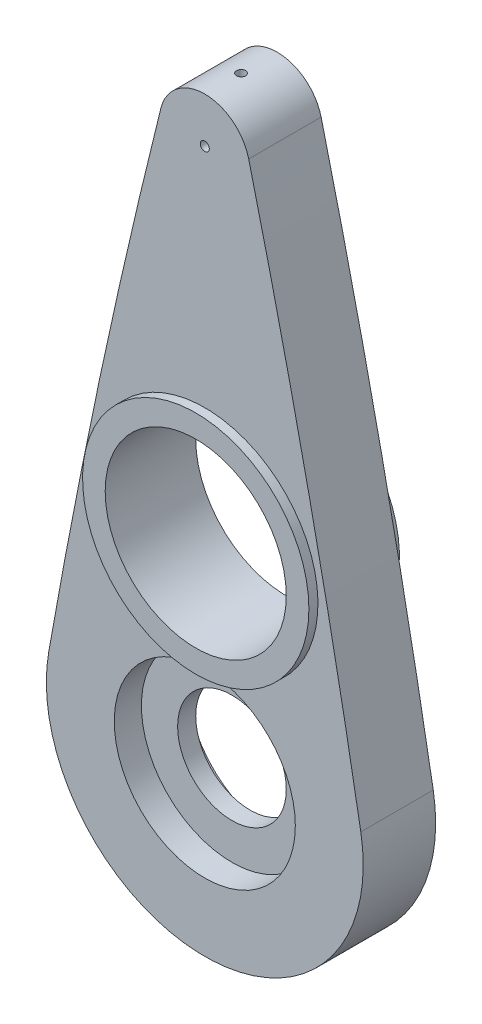
ISO-10303-21;
HEADER;
FILE_DESCRIPTION(('STEP AP214'),'2;1');
FILE_NAME('part.step','',(''),(''),'','','');
FILE_SCHEMA(('AUTOMOTIVE_DESIGN { 1 0 10303 214 1 1 1 1 }'));
ENDSEC;
DATA;
#1=APPLICATION_CONTEXT('core data for automotive mechanical design processes');
#2=APPLICATION_PROTOCOL_DEFINITION('international standard','automotive_design',2000,#1);
#3=PRODUCT_CONTEXT('',#1,'mechanical');
#4=PRODUCT('Part','Part','',(#3));
#5=PRODUCT_RELATED_PRODUCT_CATEGORY('part','',(#4));
#6=PRODUCT_DEFINITION_FORMATION('','',#4);
#7=PRODUCT_DEFINITION_CONTEXT('part definition',#1,'design');
#8=PRODUCT_DEFINITION('design','',#6,#7);
#9=PRODUCT_DEFINITION_SHAPE('','',#8);
#10=(LENGTH_UNIT() NAMED_UNIT(*) SI_UNIT(.MILLI.,.METRE.));
#11=(NAMED_UNIT(*) PLANE_ANGLE_UNIT() SI_UNIT($,.RADIAN.));
#12=(NAMED_UNIT(*) SI_UNIT($,.STERADIAN.) SOLID_ANGLE_UNIT());
#13=UNCERTAINTY_MEASURE_WITH_UNIT(LENGTH_MEASURE(1.E-05),#10,'distance_accuracy_value','');
#14=(GEOMETRIC_REPRESENTATION_CONTEXT(3) GLOBAL_UNCERTAINTY_ASSIGNED_CONTEXT((#13)) GLOBAL_UNIT_ASSIGNED_CONTEXT((#10,
#11,#12)) REPRESENTATION_CONTEXT('',''));
#15=CARTESIAN_POINT('',(0.,0.,0.));
#16=DIRECTION('',(0.,0.,1.));
#17=DIRECTION('',(1.,0.,0.));
#18=AXIS2_PLACEMENT_3D('',#15,#16,#17);
#19=CARTESIAN_POINT('',(0.,0.,8.));
#20=DIRECTION('',(0.,0.,-1.));
#21=DIRECTION('',(-1.,0.,0.));
#22=AXIS2_PLACEMENT_3D('',#19,#20,#21);
#23=CYLINDRICAL_SURFACE('',#22,6.);
#24=CARTESIAN_POINT('',(0.,0.,5.));
#25=DIRECTION('',(0.,0.,1.));
#26=DIRECTION('',(1.,0.,0.));
#27=AXIS2_PLACEMENT_3D('',#24,#25,#26);
#28=CIRCLE('',#27,6.);
#29=CARTESIAN_POINT('',(6.,0.,5.));
#30=VERTEX_POINT('',#29);
#31=EDGE_CURVE('E229',#30,#30,#28,.T.);
#32=ORIENTED_EDGE('',*,*,#31,.T.);
#33=EDGE_LOOP('',(#32));
#34=FACE_BOUND('',#33,.T.);
#35=CARTESIAN_POINT('',(0.,0.,3.));
#36=DIRECTION('',(0.,0.,-1.));
#37=DIRECTION('',(-1.,0.,0.));
#38=AXIS2_PLACEMENT_3D('',#35,#36,#37);
#39=CIRCLE('',#38,6.);
#40=CARTESIAN_POINT('',(-6.,0.,3.));
#41=VERTEX_POINT('',#40);
#42=EDGE_CURVE('E243',#41,#41,#39,.T.);
#43=ORIENTED_EDGE('',*,*,#42,.T.);
#44=EDGE_LOOP('',(#43));
#45=FACE_BOUND('',#44,.T.);
#46=ADVANCED_FACE('F38',(#34,#45),#23,.F.);
#47=CARTESIAN_POINT('',(407.406717450677,-71.8367964084237,8.));
#48=DIRECTION('',(0.,0.,1.));
#49=DIRECTION('',(1.,0.,0.));
#50=AXIS2_PLACEMENT_3D('',#47,#48,#49);
#51=PLANE('',#50);
#52=CARTESIAN_POINT('',(0.,60.,8.));
#53=DIRECTION('',(0.,0.,-1.));
#54=DIRECTION('',(-1.,0.,0.));
#55=AXIS2_PLACEMENT_3D('',#52,#53,#54);
#56=CIRCLE('',#55,0.5);
#57=CARTESIAN_POINT('',(-0.500000000000001,60.,8.));
#58=VERTEX_POINT('',#57);
#59=EDGE_CURVE('E250',#58,#58,#56,.T.);
#60=ORIENTED_EDGE('',*,*,#59,.T.);
#61=EDGE_LOOP('',(#60));
#62=FACE_BOUND('',#61,.T.);
#63=CARTESIAN_POINT('',(0.,0.,8.));
#64=DIRECTION('',(0.,0.,1.));
#65=DIRECTION('',(1.,0.,0.));
#66=AXIS2_PLACEMENT_3D('',#63,#64,#65);
#67=CIRCLE('',#66,10.);
#68=CARTESIAN_POINT('',(0.,10.,8.));
#69=VERTEX_POINT('',#68);
#70=EDGE_CURVE('E223',#69,#69,#67,.T.);
#71=ORIENTED_EDGE('',*,*,#70,.F.);
#72=CARTESIAN_POINT('',(0.,22.5,8.));
#73=DIRECTION('',(0.,0.,1.));
#74=DIRECTION('',(1.,0.,0.));
#75=AXIS2_PLACEMENT_3D('',#72,#73,#74);
#76=CIRCLE('',#75,12.5);
#77=EDGE_CURVE('E271',#69,#69,#76,.T.);
#78=ORIENTED_EDGE('',*,*,#77,.F.);
#79=EDGE_LOOP('',(#71,#78));
#80=FACE_BOUND('',#79,.T.);
#81=CARTESIAN_POINT('',(814.813434901354,-143.673592816847,8.));
#82=DIRECTION('',(0.,0.,1.));
#83=DIRECTION('',(1.,0.,0.));
#84=AXIS2_PLACEMENT_3D('',#81,#82,#83);
#85=CIRCLE('',#84,844.883245520867);
#86=CARTESIAN_POINT('',(-4.85075419260215,61.2125113454938,8.));
#87=VERTEX_POINT('',#86);
#88=CARTESIAN_POINT('',(-17.2341356777136,3.03884310917135,8.));
#89=VERTEX_POINT('',#88);
#90=EDGE_CURVE('E205',#87,#89,#85,.T.);
#91=ORIENTED_EDGE('',*,*,#90,.T.);
#92=CARTESIAN_POINT('',(0.,0.,8.));
#93=DIRECTION('',(0.,0.,1.));
#94=DIRECTION('',(1.,0.,0.));
#95=AXIS2_PLACEMENT_3D('',#92,#93,#94);
#96=CIRCLE('',#95,17.5);
#97=CARTESIAN_POINT('',(17.2341356777136,3.03884310917121,8.));
#98=VERTEX_POINT('',#97);
#99=EDGE_CURVE('E90',#89,#98,#96,.T.);
#100=ORIENTED_EDGE('',*,*,#99,.T.);
#101=CARTESIAN_POINT('',(-814.813434901354,-143.673592816848,8.));
#102=DIRECTION('',(0.,0.,1.));
#103=DIRECTION('',(-1.,0.,0.));
#104=AXIS2_PLACEMENT_3D('',#101,#102,#103);
#105=CIRCLE('',#104,844.883245520867);
#106=CARTESIAN_POINT('',(4.85075419260214,61.2125113454938,8.));
#107=VERTEX_POINT('',#106);
#108=EDGE_CURVE('E199',#98,#107,#105,.T.);
#109=ORIENTED_EDGE('',*,*,#108,.T.);
#110=CARTESIAN_POINT('',(0.,60.,8.));
#111=DIRECTION('',(0.,0.,1.));
#112=DIRECTION('',(1.,0.,0.));
#113=AXIS2_PLACEMENT_3D('',#110,#111,#112);
#114=CIRCLE('',#113,4.99999999999985);
#115=EDGE_CURVE('E62',#107,#87,#114,.T.);
#116=ORIENTED_EDGE('',*,*,#115,.T.);
#117=EDGE_LOOP('',(#91,#100,#109,#116));
#118=FACE_BOUND('',#117,.T.);
#119=ADVANCED_FACE('F165',(#62,#80,#118),#51,.T.);
#120=CARTESIAN_POINT('',(407.406717450677,-71.8367964084237,0.));
#121=DIRECTION('',(0.,0.,1.));
#122=DIRECTION('',(1.,0.,0.));
#123=AXIS2_PLACEMENT_3D('',#120,#121,#122);
#124=PLANE('',#123);
#125=CARTESIAN_POINT('',(0.,60.,0.));
#126=DIRECTION('',(0.,0.,-1.));
#127=DIRECTION('',(-1.,0.,0.));
#128=AXIS2_PLACEMENT_3D('',#125,#126,#127);
#129=CIRCLE('',#128,0.5);
#130=CARTESIAN_POINT('',(-0.500000000000001,60.,0.));
#131=VERTEX_POINT('',#130);
#132=EDGE_CURVE('E251',#131,#131,#129,.T.);
#133=ORIENTED_EDGE('',*,*,#132,.F.);
#134=EDGE_LOOP('',(#133));
#135=FACE_BOUND('',#134,.T.);
#136=CARTESIAN_POINT('',(0.,0.,0.));
#137=DIRECTION('',(0.,0.,-1.));
#138=DIRECTION('',(-1.,0.,0.));
#139=AXIS2_PLACEMENT_3D('',#136,#137,#138);
#140=CIRCLE('',#139,10.);
#141=CARTESIAN_POINT('',(0.,10.,0.));
#142=VERTEX_POINT('',#141);
#143=EDGE_CURVE('E239',#142,#142,#140,.T.);
#144=ORIENTED_EDGE('',*,*,#143,.F.);
#145=CARTESIAN_POINT('',(0.,22.5,0.));
#146=DIRECTION('',(0.,0.,-1.));
#147=DIRECTION('',(-1.,0.,0.));
#148=AXIS2_PLACEMENT_3D('',#145,#146,#147);
#149=CIRCLE('',#148,12.5);
#150=EDGE_CURVE('E259',#142,#142,#149,.T.);
#151=ORIENTED_EDGE('',*,*,#150,.F.);
#152=EDGE_LOOP('',(#144,#151));
#153=FACE_BOUND('',#152,.T.);
#154=CARTESIAN_POINT('',(814.813434901354,-143.673592816847,0.));
#155=DIRECTION('',(0.,0.,1.));
#156=DIRECTION('',(1.,0.,0.));
#157=AXIS2_PLACEMENT_3D('',#154,#155,#156);
#158=CIRCLE('',#157,844.883245520867);
#159=CARTESIAN_POINT('',(-4.85075419260215,61.2125113454938,0.));
#160=VERTEX_POINT('',#159);
#161=CARTESIAN_POINT('',(-17.2341356777136,3.03884310917135,0.));
#162=VERTEX_POINT('',#161);
#163=EDGE_CURVE('E196',#160,#162,#158,.T.);
#164=ORIENTED_EDGE('',*,*,#163,.F.);
#165=CARTESIAN_POINT('',(0.,60.,0.));
#166=DIRECTION('',(0.,0.,1.));
#167=DIRECTION('',(1.,0.,0.));
#168=AXIS2_PLACEMENT_3D('',#165,#166,#167);
#169=CIRCLE('',#168,4.99999999999985);
#170=CARTESIAN_POINT('',(4.85075419260214,61.2125113454938,0.));
#171=VERTEX_POINT('',#170);
#172=EDGE_CURVE('E83',#171,#160,#169,.T.);
#173=ORIENTED_EDGE('',*,*,#172,.F.);
#174=CARTESIAN_POINT('',(-814.813434901354,-143.673592816848,0.));
#175=DIRECTION('',(0.,0.,1.));
#176=DIRECTION('',(-1.,0.,0.));
#177=AXIS2_PLACEMENT_3D('',#174,#175,#176);
#178=CIRCLE('',#177,844.883245520867);
#179=CARTESIAN_POINT('',(17.2341356777136,3.03884310917121,0.));
#180=VERTEX_POINT('',#179);
#181=EDGE_CURVE('E195',#180,#171,#178,.T.);
#182=ORIENTED_EDGE('',*,*,#181,.F.);
#183=CARTESIAN_POINT('',(0.,0.,0.));
#184=DIRECTION('',(0.,0.,1.));
#185=DIRECTION('',(1.,0.,0.));
#186=AXIS2_PLACEMENT_3D('',#183,#184,#185);
#187=CIRCLE('',#186,17.5);
#188=EDGE_CURVE('E186',#162,#180,#187,.T.);
#189=ORIENTED_EDGE('',*,*,#188,.F.);
#190=EDGE_LOOP('',(#164,#173,#182,#189));
#191=FACE_BOUND('',#190,.T.);
#192=ADVANCED_FACE('F169',(#135,#153,#191),#124,.F.);
#193=CARTESIAN_POINT('',(814.813434901354,-143.673592816847,8.));
#194=DIRECTION('',(0.,0.,-1.));
#195=DIRECTION('',(-1.,0.,0.));
#196=AXIS2_PLACEMENT_3D('',#193,#194,#195);
#197=CYLINDRICAL_SURFACE('',#196,844.883245520867);
#198=ORIENTED_EDGE('',*,*,#163,.T.);
#199=DIRECTION('',(0.,0.,-1.));
#200=VECTOR('',#199,1.);
#201=CARTESIAN_POINT('',(-17.2341356777136,3.03884310917135,8.));
#202=LINE('',#201,#200);
#203=EDGE_CURVE('E11',#89,#162,#202,.T.);
#204=ORIENTED_EDGE('',*,*,#203,.F.);
#205=ORIENTED_EDGE('',*,*,#90,.F.);
#206=DIRECTION('',(0.,0.,-1.));
#207=VECTOR('',#206,1.);
#208=CARTESIAN_POINT('',(-4.85075419260215,61.2125113454938,8.));
#209=LINE('',#208,#207);
#210=EDGE_CURVE('E209',#87,#160,#209,.T.);
#211=ORIENTED_EDGE('',*,*,#210,.T.);
#212=EDGE_LOOP('',(#198,#204,#205,#211));
#213=FACE_BOUND('',#212,.T.);
#214=ADVANCED_FACE('F40',(#213),#197,.T.);
#215=CARTESIAN_POINT('',(0.,0.,8.));
#216=DIRECTION('',(0.,0.,-1.));
#217=DIRECTION('',(-1.,0.,0.));
#218=AXIS2_PLACEMENT_3D('',#215,#216,#217);
#219=CYLINDRICAL_SURFACE('',#218,17.5);
#220=ORIENTED_EDGE('',*,*,#188,.T.);
#221=DIRECTION('',(0.,0.,-1.));
#222=VECTOR('',#221,1.);
#223=CARTESIAN_POINT('',(17.2341356777136,3.03884310917121,8.));
#224=LINE('',#223,#222);
#225=EDGE_CURVE('E47',#98,#180,#224,.T.);
#226=ORIENTED_EDGE('',*,*,#225,.F.);
#227=ORIENTED_EDGE('',*,*,#99,.F.);
#228=ORIENTED_EDGE('',*,*,#203,.T.);
#229=EDGE_LOOP('',(#220,#226,#227,#228));
#230=FACE_BOUND('',#229,.T.);
#231=ADVANCED_FACE('F179',(#230),#219,.T.);
#232=CARTESIAN_POINT('',(-814.813434901354,-143.673592816848,8.));
#233=DIRECTION('',(0.,0.,-1.));
#234=DIRECTION('',(-1.,0.,0.));
#235=AXIS2_PLACEMENT_3D('',#232,#233,#234);
#236=CYLINDRICAL_SURFACE('',#235,844.883245520867);
#237=ORIENTED_EDGE('',*,*,#181,.T.);
#238=DIRECTION('',(0.,0.,-1.));
#239=VECTOR('',#238,1.);
#240=CARTESIAN_POINT('',(4.85075419260214,61.2125113454938,8.));
#241=LINE('',#240,#239);
#242=EDGE_CURVE('E201',#107,#171,#241,.T.);
#243=ORIENTED_EDGE('',*,*,#242,.F.);
#244=ORIENTED_EDGE('',*,*,#108,.F.);
#245=ORIENTED_EDGE('',*,*,#225,.T.);
#246=EDGE_LOOP('',(#237,#243,#244,#245));
#247=FACE_BOUND('',#246,.T.);
#248=ADVANCED_FACE('F176',(#247),#236,.T.);
#249=CARTESIAN_POINT('',(0.,60.,8.));
#250=DIRECTION('',(0.,0.,-1.));
#251=DIRECTION('',(-1.,0.,0.));
#252=AXIS2_PLACEMENT_3D('',#249,#250,#251);
#253=CYLINDRICAL_SURFACE('',#252,4.99999999999985);
#254=CARTESIAN_POINT('',(-0.500000000000001,64.974937185533,4.));
#255=CARTESIAN_POINT('',(-0.499998786696756,64.9749375139844,4.0280097820868));
#256=CARTESIAN_POINT('',(-0.497638429491238,64.9751762849709,4.05603808420592));
#257=CARTESIAN_POINT('',(-0.488258157381781,64.9761054377904,4.11131759314677));
#258=CARTESIAN_POINT('',(-0.481233107443218,64.9767963173059,4.13856790901874));
#259=CARTESIAN_POINT('',(-0.462730058034464,64.9785506652368,4.19148290960895));
#260=CARTESIAN_POINT('',(-0.45125475814695,64.9796139077338,4.21714854469572));
#261=CARTESIAN_POINT('',(-0.424182133695552,64.9819929028589,4.26618389614587));
#262=CARTESIAN_POINT('',(-0.408585627812964,64.9833086053215,4.28955406724186));
#263=CARTESIAN_POINT('',(-0.373652380999353,64.9860496335493,4.33342563182875));
#264=CARTESIAN_POINT('',(-0.35430370905413,64.9874753000262,4.35391750475189));
#265=CARTESIAN_POINT('',(-0.312440857659783,64.9902725261784,4.39136880450178));
#266=CARTESIAN_POINT('',(-0.289926533453285,64.9916440833759,4.40832806970316));
#267=CARTESIAN_POINT('',(-0.242313180825495,64.9941819157779,4.43826562850358));
#268=CARTESIAN_POINT('',(-0.217208831264786,64.9953477544731,4.45123549939683));
#269=CARTESIAN_POINT('',(-0.165164992143756,64.9973390843787,4.47277221657434));
#270=CARTESIAN_POINT('',(-0.13822554733411,64.9981645838852,4.48133917018473));
#271=CARTESIAN_POINT('',(-0.0833723913714754,64.999379832855,4.49379895467662));
#272=CARTESIAN_POINT('',(-0.0554622635157914,64.9997710392139,4.49770741637497));
#273=CARTESIAN_POINT('',(0.000620370344470735,65.0000785779933,4.50078763456686));
#274=CARTESIAN_POINT('',(0.0287928695272298,64.9999949227262,4.49995951387314));
#275=CARTESIAN_POINT('',(0.084494422032279,64.9993633565558,4.49360276367492));
#276=CARTESIAN_POINT('',(0.112025414967488,64.9988171057584,4.48809094221805));
#277=CARTESIAN_POINT('',(0.165769589752265,64.9973236463245,4.47254943552669));
#278=CARTESIAN_POINT('',(0.191982754478864,64.9963764324796,4.46251969160621));
#279=CARTESIAN_POINT('',(0.242400157339792,64.9941846874194,4.43820861837278));
#280=CARTESIAN_POINT('',(0.266600785490824,64.9929396368286,4.42391985123492));
#281=CARTESIAN_POINT('',(0.312266756587096,64.9902919225969,4.39150173833182));
#282=CARTESIAN_POINT('',(0.333732019280413,64.9888892543339,4.37337227992741));
#283=CARTESIAN_POINT('',(0.373416385911344,64.9860764673391,4.33369288524318));
#284=CARTESIAN_POINT('',(0.391620873095171,64.984666342865,4.31212832762921));
#285=CARTESIAN_POINT('',(0.424153767678958,64.982003699641,4.26624156739461));
#286=CARTESIAN_POINT('',(0.438482169456444,64.9807511811197,4.24191936077393));
#287=CARTESIAN_POINT('',(0.462856092286615,64.9785454475706,4.1911964874001));
#288=CARTESIAN_POINT('',(0.472900710286479,64.9775922956626,4.16479538378856));
#289=CARTESIAN_POINT('',(0.488410367818794,64.9760945093545,4.11066969769266));
#290=CARTESIAN_POINT('',(0.493875546871516,64.9755498625087,4.08294515555628));
#291=CARTESIAN_POINT('',(0.500052387695979,64.9749329026369,4.02708791023525));
#292=CARTESIAN_POINT('',(0.500784498323605,64.9748585577379,3.99895748986758));
#293=CARTESIAN_POINT('',(0.49752812343568,64.9751852567737,3.94297436708857));
#294=CARTESIAN_POINT('',(0.493539701704876,64.9755862942852,3.91512166092982));
#295=CARTESIAN_POINT('',(0.480972587253759,64.9768167221118,3.86054420886083));
#296=CARTESIAN_POINT('',(0.472403563594453,64.9776452100066,3.83381721445267));
#297=CARTESIAN_POINT('',(0.450928359837969,64.9796364551938,3.78217997413485));
#298=CARTESIAN_POINT('',(0.438022080391793,64.9807992201432,3.75726976985641));
#299=CARTESIAN_POINT('',(0.408187500711608,64.9833329217784,3.70988001298561));
#300=CARTESIAN_POINT('',(0.391245649920345,64.9847045540732,3.68740902901687));
#301=CARTESIAN_POINT('',(0.353840266725587,64.9874991631258,3.64562247336297));
#302=CARTESIAN_POINT('',(0.333376647124067,64.9889221411542,3.62630697982996));
#303=CARTESIAN_POINT('',(0.289419902113236,64.9916652392463,3.59130918330095));
#304=CARTESIAN_POINT('',(0.265916127984726,64.9929849702772,3.57564022020689));
#305=CARTESIAN_POINT('',(0.216598858708565,64.995367210533,3.54847206574679));
#306=CARTESIAN_POINT('',(0.190785395214813,64.9964297232823,3.53697281724645));
#307=CARTESIAN_POINT('',(0.137628063216407,64.9981760520699,3.51849311617233));
#308=CARTESIAN_POINT('',(0.110287018824979,64.9988605430281,3.51150460633739));
#309=CARTESIAN_POINT('',(0.054812406991839,64.9997764730681,3.50221846521008));
#310=CARTESIAN_POINT('',(0.0266788618461081,65.0000079248827,3.49992070208298));
#311=CARTESIAN_POINT('',(-0.0294511120378742,64.9999916915662,3.50008313321997));
#312=CARTESIAN_POINT('',(-0.0574476036122649,64.9997460918832,3.50252261841833));
#313=CARTESIAN_POINT('',(-0.112630944178182,64.9988074678878,3.51204687282849));
#314=CARTESIAN_POINT('',(-0.139817792534184,64.9981144432242,3.51913164568648));
#315=CARTESIAN_POINT('',(-0.192609954383872,64.9963586190697,3.53773962869647));
#316=CARTESIAN_POINT('',(-0.218215483038765,64.9952958700161,3.54926223346708));
#317=CARTESIAN_POINT('',(-0.267132300077398,64.9929190620813,3.57641658445849));
#318=CARTESIAN_POINT('',(-0.29044360188428,64.9916050046706,3.59204830663556));
#319=CARTESIAN_POINT('',(-0.33421636221347,64.9888659233451,3.62705480951188));
#320=CARTESIAN_POINT('',(-0.354665463109671,64.9874404573033,3.6464450081224));
#321=CARTESIAN_POINT('',(-0.392028879696572,64.9846429538481,3.68838767577272));
#322=CARTESIAN_POINT('',(-0.408942345923925,64.9832709293387,3.71094090258454));
#323=CARTESIAN_POINT('',(-0.438788320212027,64.9807319170529,3.75863217095996));
#324=CARTESIAN_POINT('',(-0.451710593997418,64.9795654596264,3.78377664066203));
#325=CARTESIAN_POINT('',(-0.473132354049385,64.9775759738122,3.83587414562312));
#326=CARTESIAN_POINT('',(-0.481636828944929,64.9767525582666,3.86282510196286));
#327=CARTESIAN_POINT('',(-0.491860844166765,64.9757500376906,3.90827387044956));
#328=CARTESIAN_POINT('',(-0.494908856199113,64.9754466596783,3.92648112565321));
#329=CARTESIAN_POINT('',(-0.498978829302557,64.9750401258882,3.96312291152128));
#330=CARTESIAN_POINT('',(-0.500000798878632,64.9749369692698,3.9815574412313));
#331=CARTESIAN_POINT('',(-0.500000000000001,64.974937185533,4.));
#332=B_SPLINE_CURVE_WITH_KNOTS('',3,(#254,#255,#256,#257,#258,#259,#260,#261,#262,#263,#264,
#265,#266,#267,#268,#269,#270,#271,#272,#273,#274,#275,#276,#277,#278,#279,#280,#281,#282,#283,
#284,#285,#286,#287,#288,#289,#290,#291,#292,#293,#294,#295,#296,#297,#298,#299,#300,#301,#302,
#303,#304,#305,#306,#307,#308,#309,#310,#311,#312,#313,#314,#315,#316,#317,#318,#319,#320,#321,
#322,#323,#324,#325,#326,#327,#328,#329,#330,#331),.UNSPECIFIED.,.T.,.F.,(4,2,2,2,2,2,2,2,2,2,2,
2,2,2,2,2,2,2,2,2,2,2,2,2,2,2,2,2,2,2,2,2,2,2,2,2,2,2,4),(0.,0.0839619972182316,
0.168016575910885,0.252020245498736,0.336007240210657,0.420265807649625,0.504528229276263,
0.588967349856457,0.673404412038973,0.757557354492247,0.841708114991161,0.925558159093307,
1.00940929240487,1.09340772733207,1.17740862609264,1.26177712542501,1.34614574713781,
1.43053214558967,1.51491597297516,1.59893498153883,1.68295285483435,1.76679407352264,
1.85063721280524,1.93476594905859,2.01889676861601,2.10333068409059,2.18776344259002,
2.27204496347181,2.35632411556575,2.44023566734242,2.52414728498329,2.60804745997623,
2.69194714405399,2.77619857518994,2.86047022517262,2.94495620535238,3.02934657447,
3.08463013803023,3.13991346951908),.UNSPECIFIED.);
#333=CARTESIAN_POINT('',(-0.500000000000001,64.974937185533,4.));
#334=VERTEX_POINT('',#333);
#335=EDGE_CURVE('E107',#334,#334,#332,.T.);
#336=ORIENTED_EDGE('',*,*,#335,.F.);
#337=EDGE_LOOP('',(#336));
#338=FACE_BOUND('',#337,.T.);
#339=ORIENTED_EDGE('',*,*,#172,.T.);
#340=ORIENTED_EDGE('',*,*,#210,.F.);
#341=ORIENTED_EDGE('',*,*,#115,.F.);
#342=ORIENTED_EDGE('',*,*,#242,.T.);
#343=EDGE_LOOP('',(#339,#340,#341,#342));
#344=FACE_BOUND('',#343,.T.);
#345=ADVANCED_FACE('F161',(#338,#344),#253,.T.);
#346=CARTESIAN_POINT('',(0.,0.,5.));
#347=DIRECTION('',(0.,0.,1.));
#348=DIRECTION('',(1.,0.,0.));
#349=AXIS2_PLACEMENT_3D('',#346,#347,#348);
#350=CYLINDRICAL_SURFACE('',#349,10.);
#351=CARTESIAN_POINT('',(0.,0.,5.));
#352=DIRECTION('',(0.,0.,1.));
#353=DIRECTION('',(1.,0.,0.));
#354=AXIS2_PLACEMENT_3D('',#351,#352,#353);
#355=CIRCLE('',#354,10.);
#356=CARTESIAN_POINT('',(10.,0.,5.));
#357=VERTEX_POINT('',#356);
#358=EDGE_CURVE('E220',#357,#357,#355,.T.);
#359=ORIENTED_EDGE('',*,*,#358,.F.);
#360=EDGE_LOOP('',(#359));
#361=FACE_BOUND('',#360,.T.);
#362=ORIENTED_EDGE('',*,*,#70,.T.);
#363=EDGE_LOOP('',(#362));
#364=FACE_BOUND('',#363,.T.);
#365=ADVANCED_FACE('F157',(#361,#364),#350,.F.);
#366=CARTESIAN_POINT('',(0.,0.,5.));
#367=DIRECTION('',(0.,0.,1.));
#368=DIRECTION('',(1.,0.,0.));
#369=AXIS2_PLACEMENT_3D('',#366,#367,#368);
#370=PLANE('',#369);
#371=ORIENTED_EDGE('',*,*,#31,.F.);
#372=EDGE_LOOP('',(#371));
#373=FACE_BOUND('',#372,.T.);
#374=ORIENTED_EDGE('',*,*,#358,.T.);
#375=EDGE_LOOP('',(#374));
#376=FACE_BOUND('',#375,.T.);
#377=ADVANCED_FACE('F153',(#373,#376),#370,.T.);
#378=CARTESIAN_POINT('',(0.,0.,3.));
#379=DIRECTION('',(0.,0.,-1.));
#380=DIRECTION('',(-1.,0.,0.));
#381=AXIS2_PLACEMENT_3D('',#378,#379,#380);
#382=CYLINDRICAL_SURFACE('',#381,10.);
#383=CARTESIAN_POINT('',(0.,0.,3.));
#384=DIRECTION('',(0.,0.,-1.));
#385=DIRECTION('',(-1.,0.,0.));
#386=AXIS2_PLACEMENT_3D('',#383,#384,#385);
#387=CIRCLE('',#386,10.);
#388=CARTESIAN_POINT('',(-10.,0.,3.));
#389=VERTEX_POINT('',#388);
#390=EDGE_CURVE('E238',#389,#389,#387,.T.);
#391=ORIENTED_EDGE('',*,*,#390,.F.);
#392=EDGE_LOOP('',(#391));
#393=FACE_BOUND('',#392,.T.);
#394=ORIENTED_EDGE('',*,*,#143,.T.);
#395=EDGE_LOOP('',(#394));
#396=FACE_BOUND('',#395,.T.);
#397=ADVANCED_FACE('F149',(#393,#396),#382,.F.);
#398=CARTESIAN_POINT('',(0.,0.,3.));
#399=DIRECTION('',(0.,0.,-1.));
#400=DIRECTION('',(-1.,0.,0.));
#401=AXIS2_PLACEMENT_3D('',#398,#399,#400);
#402=PLANE('',#401);
#403=ORIENTED_EDGE('',*,*,#42,.F.);
#404=EDGE_LOOP('',(#403));
#405=FACE_BOUND('',#404,.T.);
#406=ORIENTED_EDGE('',*,*,#390,.T.);
#407=EDGE_LOOP('',(#406));
#408=FACE_BOUND('',#407,.T.);
#409=ADVANCED_FACE('F146',(#405,#408),#402,.T.);
#410=CARTESIAN_POINT('',(0.,60.,8.));
#411=DIRECTION('',(0.,0.,-1.));
#412=DIRECTION('',(-1.,0.,0.));
#413=AXIS2_PLACEMENT_3D('',#410,#411,#412);
#414=CYLINDRICAL_SURFACE('',#413,0.5);
#415=CARTESIAN_POINT('',(0.,60.,4.));
#416=DIRECTION('',(0.,0.707106781186547,0.707106781186547));
#417=DIRECTION('',(0.,0.707106781186547,-0.707106781186547));
#418=AXIS2_PLACEMENT_3D('',#415,#416,#417);
#419=ELLIPSE('',#418,0.707106781186548,0.5);
#420=CARTESIAN_POINT('',(-0.500000000000001,60.,4.));
#421=VERTEX_POINT('',#420);
#422=CARTESIAN_POINT('',(0.5,60.,4.));
#423=VERTEX_POINT('',#422);
#424=EDGE_CURVE('E98',#421,#423,#419,.F.);
#425=ORIENTED_EDGE('',*,*,#424,.F.);
#426=CARTESIAN_POINT('',(0.,60.,4.));
#427=DIRECTION('',(0.,0.707106781186547,-0.707106781186547));
#428=DIRECTION('',(0.,0.707106781186547,0.707106781186547));
#429=AXIS2_PLACEMENT_3D('',#426,#427,#428);
#430=ELLIPSE('',#429,0.707106781186548,0.5);
#431=EDGE_CURVE('E53',#423,#421,#430,.F.);
#432=ORIENTED_EDGE('',*,*,#431,.F.);
#433=EDGE_LOOP('',(#425,#432));
#434=FACE_BOUND('',#433,.T.);
#435=ORIENTED_EDGE('',*,*,#59,.F.);
#436=EDGE_LOOP('',(#435));
#437=FACE_BOUND('',#436,.T.);
#438=ORIENTED_EDGE('',*,*,#132,.T.);
#439=EDGE_LOOP('',(#438));
#440=FACE_BOUND('',#439,.T.);
#441=ADVANCED_FACE('F104',(#434,#437,#440),#414,.F.);
#442=CARTESIAN_POINT('',(0.,22.5,8.));
#443=DIRECTION('',(0.,0.,-1.));
#444=DIRECTION('',(-1.,0.,0.));
#445=AXIS2_PLACEMENT_3D('',#442,#443,#444);
#446=CYLINDRICAL_SURFACE('',#445,10.);
#447=CARTESIAN_POINT('',(0.,22.5,-1.));
#448=DIRECTION('',(0.,0.,-1.));
#449=DIRECTION('',(-1.,0.,0.));
#450=AXIS2_PLACEMENT_3D('',#447,#448,#449);
#451=CIRCLE('',#450,10.);
#452=CARTESIAN_POINT('',(-10.,22.5,-1.));
#453=VERTEX_POINT('',#452);
#454=EDGE_CURVE('E263',#453,#453,#451,.T.);
#455=ORIENTED_EDGE('',*,*,#454,.T.);
#456=EDGE_LOOP('',(#455));
#457=FACE_BOUND('',#456,.T.);
#458=CARTESIAN_POINT('',(0.,22.5,9.));
#459=DIRECTION('',(0.,0.,1.));
#460=DIRECTION('',(1.,0.,0.));
#461=AXIS2_PLACEMENT_3D('',#458,#459,#460);
#462=CIRCLE('',#461,10.);
#463=CARTESIAN_POINT('',(10.,22.5,9.));
#464=VERTEX_POINT('',#463);
#465=EDGE_CURVE('E111',#464,#464,#462,.T.);
#466=ORIENTED_EDGE('',*,*,#465,.T.);
#467=EDGE_LOOP('',(#466));
#468=FACE_BOUND('',#467,.T.);
#469=ADVANCED_FACE('F136',(#457,#468),#446,.F.);
#470=CARTESIAN_POINT('',(0.,22.5,-1.));
#471=DIRECTION('',(0.,0.,-1.));
#472=DIRECTION('',(-1.,0.,0.));
#473=AXIS2_PLACEMENT_3D('',#470,#471,#472);
#474=PLANE('',#473);
#475=CARTESIAN_POINT('',(0.,22.5,-1.));
#476=DIRECTION('',(0.,0.,-1.));
#477=DIRECTION('',(-1.,0.,0.));
#478=AXIS2_PLACEMENT_3D('',#475,#476,#477);
#479=CIRCLE('',#478,12.5);
#480=CARTESIAN_POINT('',(-12.5,22.5,-1.));
#481=VERTEX_POINT('',#480);
#482=EDGE_CURVE('E255',#481,#481,#479,.T.);
#483=ORIENTED_EDGE('',*,*,#482,.T.);
#484=EDGE_LOOP('',(#483));
#485=FACE_BOUND('',#484,.T.);
#486=ORIENTED_EDGE('',*,*,#454,.F.);
#487=EDGE_LOOP('',(#486));
#488=FACE_BOUND('',#487,.T.);
#489=ADVANCED_FACE('F133',(#485,#488),#474,.T.);
#490=CARTESIAN_POINT('',(0.,22.5,-1.));
#491=DIRECTION('',(0.,0.,1.));
#492=DIRECTION('',(1.,0.,0.));
#493=AXIS2_PLACEMENT_3D('',#490,#491,#492);
#494=CYLINDRICAL_SURFACE('',#493,12.5);
#495=ORIENTED_EDGE('',*,*,#482,.F.);
#496=EDGE_LOOP('',(#495));
#497=FACE_BOUND('',#496,.T.);
#498=ORIENTED_EDGE('',*,*,#150,.T.);
#499=EDGE_LOOP('',(#498));
#500=FACE_BOUND('',#499,.T.);
#501=ADVANCED_FACE('F128',(#497,#500),#494,.T.);
#502=CARTESIAN_POINT('',(0.,22.5,9.));
#503=DIRECTION('',(0.,0.,1.));
#504=DIRECTION('',(1.,0.,0.));
#505=AXIS2_PLACEMENT_3D('',#502,#503,#504);
#506=PLANE('',#505);
#507=CARTESIAN_POINT('',(0.,22.5,9.));
#508=DIRECTION('',(0.,0.,1.));
#509=DIRECTION('',(1.,0.,0.));
#510=AXIS2_PLACEMENT_3D('',#507,#508,#509);
#511=CIRCLE('',#510,12.5);
#512=CARTESIAN_POINT('',(12.5,22.5,9.));
#513=VERTEX_POINT('',#512);
#514=EDGE_CURVE('E270',#513,#513,#511,.T.);
#515=ORIENTED_EDGE('',*,*,#514,.T.);
#516=EDGE_LOOP('',(#515));
#517=FACE_BOUND('',#516,.T.);
#518=ORIENTED_EDGE('',*,*,#465,.F.);
#519=EDGE_LOOP('',(#518));
#520=FACE_BOUND('',#519,.T.);
#521=ADVANCED_FACE('F125',(#517,#520),#506,.T.);
#522=CARTESIAN_POINT('',(0.,22.5,9.));
#523=DIRECTION('',(0.,0.,-1.));
#524=DIRECTION('',(-1.,0.,0.));
#525=AXIS2_PLACEMENT_3D('',#522,#523,#524);
#526=CYLINDRICAL_SURFACE('',#525,12.5);
#527=ORIENTED_EDGE('',*,*,#514,.F.);
#528=EDGE_LOOP('',(#527));
#529=FACE_BOUND('',#528,.T.);
#530=ORIENTED_EDGE('',*,*,#77,.T.);
#531=EDGE_LOOP('',(#530));
#532=FACE_BOUND('',#531,.T.);
#533=ADVANCED_FACE('F124',(#529,#532),#526,.T.);
#534=CARTESIAN_POINT('',(0.,-17.501,4.));
#535=DIRECTION('',(0.,1.,0.));
#536=DIRECTION('',(-1.,0.,0.));
#537=AXIS2_PLACEMENT_3D('',#534,#535,#536);
#538=CYLINDRICAL_SURFACE('',#537,0.5);
#539=ORIENTED_EDGE('',*,*,#431,.T.);
#540=ORIENTED_EDGE('',*,*,#424,.T.);
#541=EDGE_LOOP('',(#539,#540));
#542=FACE_BOUND('',#541,.T.);
#543=ORIENTED_EDGE('',*,*,#335,.T.);
#544=EDGE_LOOP('',(#543));
#545=FACE_BOUND('',#544,.T.);
#546=ADVANCED_FACE('F99',(#542,#545),#538,.F.);
#547=CLOSED_SHELL('',(#46,#119,#192,#214,#231,#248,#345,#365,#377,#397,#409,#441,#469,#489,#501,
#521,#533,#546));
#548=MANIFOLD_SOLID_BREP('B2',#547);
#549=ADVANCED_BREP_SHAPE_REPRESENTATION('',(#18,#548),#14);
#550=SHAPE_DEFINITION_REPRESENTATION(#9,#549);
ENDSEC;
END-ISO-10303-21;
